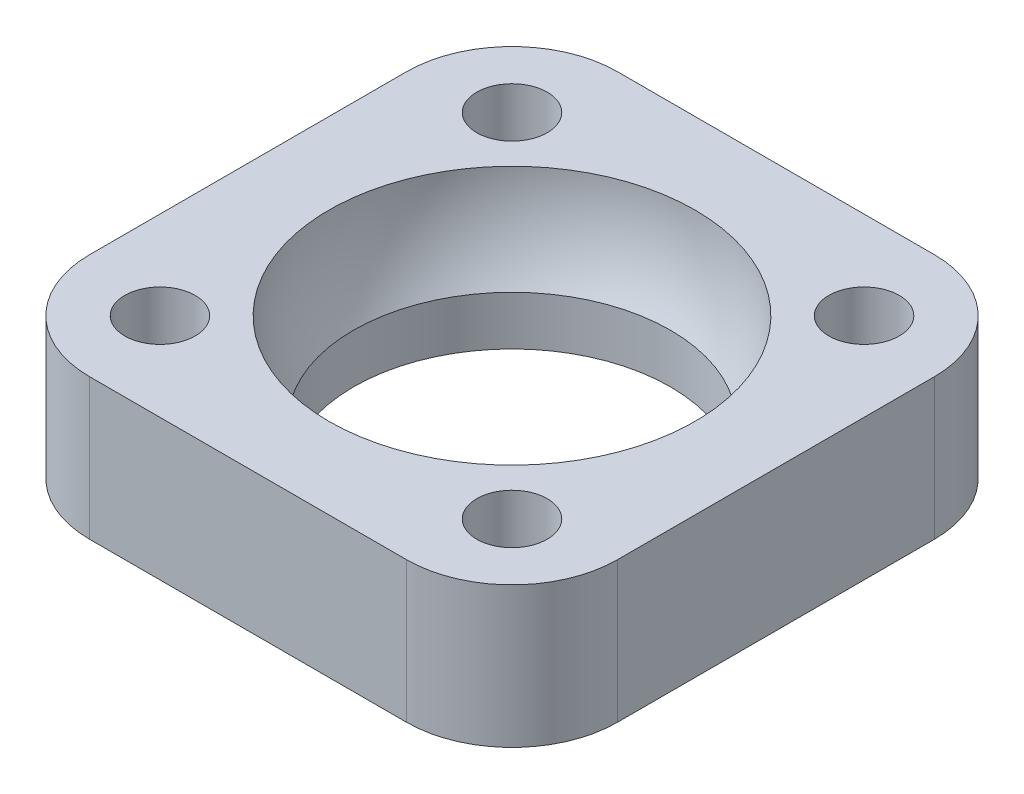
ISO-10303-21;
HEADER;
FILE_DESCRIPTION(('STEP AP214'),'2;1');
FILE_NAME('part.step','',(''),(''),'','','');
FILE_SCHEMA(('AUTOMOTIVE_DESIGN { 1 0 10303 214 1 1 1 1 }'));
ENDSEC;
DATA;
#1=APPLICATION_CONTEXT('core data for automotive mechanical design processes');
#2=APPLICATION_PROTOCOL_DEFINITION('international standard','automotive_design',2000,#1);
#3=PRODUCT_CONTEXT('',#1,'mechanical');
#4=PRODUCT('Part','Part','',(#3));
#5=PRODUCT_RELATED_PRODUCT_CATEGORY('part','',(#4));
#6=PRODUCT_DEFINITION_FORMATION('','',#4);
#7=PRODUCT_DEFINITION_CONTEXT('part definition',#1,'design');
#8=PRODUCT_DEFINITION('design','',#6,#7);
#9=PRODUCT_DEFINITION_SHAPE('','',#8);
#10=(LENGTH_UNIT() NAMED_UNIT(*) SI_UNIT(.MILLI.,.METRE.));
#11=(NAMED_UNIT(*) PLANE_ANGLE_UNIT() SI_UNIT($,.RADIAN.));
#12=(NAMED_UNIT(*) SI_UNIT($,.STERADIAN.) SOLID_ANGLE_UNIT());
#13=UNCERTAINTY_MEASURE_WITH_UNIT(LENGTH_MEASURE(1.E-05),#10,'distance_accuracy_value','');
#14=(GEOMETRIC_REPRESENTATION_CONTEXT(3) GLOBAL_UNCERTAINTY_ASSIGNED_CONTEXT((#13)) GLOBAL_UNIT_ASSIGNED_CONTEXT((#10,
#11,#12)) REPRESENTATION_CONTEXT('',''));
#15=CARTESIAN_POINT('',(0.,0.,0.));
#16=DIRECTION('',(0.,0.,1.));
#17=DIRECTION('',(1.,0.,0.));
#18=AXIS2_PLACEMENT_3D('',#15,#16,#17);
#19=CARTESIAN_POINT('',(0.,4.,0.));
#20=DIRECTION('',(1.,0.,0.));
#21=DIRECTION('',(0.,0.,-1.));
#22=AXIS2_PLACEMENT_3D('',#19,#20,#21);
#23=PLANE('',#22);
#24=DIRECTION('',(0.,0.,1.));
#25=VECTOR('',#24,1.);
#26=CARTESIAN_POINT('',(0.,0.,0.));
#27=LINE('',#26,#25);
#28=CARTESIAN_POINT('',(0.,0.,3.));
#29=VERTEX_POINT('',#28);
#30=CARTESIAN_POINT('',(0.,0.,12.));
#31=VERTEX_POINT('',#30);
#32=EDGE_CURVE('E130',#29,#31,#27,.T.);
#33=ORIENTED_EDGE('',*,*,#32,.T.);
#34=DIRECTION('',(0.,-1.,0.));
#35=VECTOR('',#34,1.);
#36=CARTESIAN_POINT('',(0.,4.,12.));
#37=LINE('',#36,#35);
#38=CARTESIAN_POINT('',(0.,4.,12.));
#39=VERTEX_POINT('',#38);
#40=EDGE_CURVE('E157',#31,#39,#37,.F.);
#41=ORIENTED_EDGE('',*,*,#40,.T.);
#42=DIRECTION('',(0.,0.,1.));
#43=VECTOR('',#42,1.);
#44=CARTESIAN_POINT('',(0.,4.,0.));
#45=LINE('',#44,#43);
#46=CARTESIAN_POINT('',(0.,4.,3.));
#47=VERTEX_POINT('',#46);
#48=EDGE_CURVE('E128',#47,#39,#45,.T.);
#49=ORIENTED_EDGE('',*,*,#48,.F.);
#50=DIRECTION('',(0.,-1.,0.));
#51=VECTOR('',#50,1.);
#52=CARTESIAN_POINT('',(0.,4.,3.));
#53=LINE('',#52,#51);
#54=EDGE_CURVE('E154',#47,#29,#53,.T.);
#55=ORIENTED_EDGE('',*,*,#54,.T.);
#56=EDGE_LOOP('',(#33,#41,#49,#55));
#57=FACE_BOUND('',#56,.T.);
#58=ADVANCED_FACE('F33',(#57),#23,.F.);
#59=CARTESIAN_POINT('',(0.,4.,15.));
#60=DIRECTION('',(0.,0.,-1.));
#61=DIRECTION('',(-1.,0.,0.));
#62=AXIS2_PLACEMENT_3D('',#59,#60,#61);
#63=PLANE('',#62);
#64=DIRECTION('',(1.,0.,0.));
#65=VECTOR('',#64,1.);
#66=CARTESIAN_POINT('',(0.,0.,15.));
#67=LINE('',#66,#65);
#68=CARTESIAN_POINT('',(3.,0.,15.));
#69=VERTEX_POINT('',#68);
#70=CARTESIAN_POINT('',(12.,0.,15.));
#71=VERTEX_POINT('',#70);
#72=EDGE_CURVE('E126',#69,#71,#67,.T.);
#73=ORIENTED_EDGE('',*,*,#72,.T.);
#74=DIRECTION('',(0.,-1.,0.));
#75=VECTOR('',#74,1.);
#76=CARTESIAN_POINT('',(12.,4.,15.));
#77=LINE('',#76,#75);
#78=CARTESIAN_POINT('',(12.,4.,15.));
#79=VERTEX_POINT('',#78);
#80=EDGE_CURVE('E104',#71,#79,#77,.F.);
#81=ORIENTED_EDGE('',*,*,#80,.T.);
#82=DIRECTION('',(1.,0.,0.));
#83=VECTOR('',#82,1.);
#84=CARTESIAN_POINT('',(0.,4.,15.));
#85=LINE('',#84,#83);
#86=CARTESIAN_POINT('',(3.,4.,15.));
#87=VERTEX_POINT('',#86);
#88=EDGE_CURVE('E171',#87,#79,#85,.T.);
#89=ORIENTED_EDGE('',*,*,#88,.F.);
#90=DIRECTION('',(0.,-1.,0.));
#91=VECTOR('',#90,1.);
#92=CARTESIAN_POINT('',(3.,4.,15.));
#93=LINE('',#92,#91);
#94=EDGE_CURVE('E109',#87,#69,#93,.T.);
#95=ORIENTED_EDGE('',*,*,#94,.T.);
#96=EDGE_LOOP('',(#73,#81,#89,#95));
#97=FACE_BOUND('',#96,.T.);
#98=ADVANCED_FACE('F176',(#97),#63,.F.);
#99=CARTESIAN_POINT('',(15.,4.,0.));
#100=DIRECTION('',(-1.,0.,0.));
#101=DIRECTION('',(0.,0.,1.));
#102=AXIS2_PLACEMENT_3D('',#99,#100,#101);
#103=PLANE('',#102);
#104=DIRECTION('',(0.,0.,-1.));
#105=VECTOR('',#104,1.);
#106=CARTESIAN_POINT('',(15.,4.,0.));
#107=LINE('',#106,#105);
#108=CARTESIAN_POINT('',(15.,4.,12.));
#109=VERTEX_POINT('',#108);
#110=CARTESIAN_POINT('',(15.,4.,3.));
#111=VERTEX_POINT('',#110);
#112=EDGE_CURVE('E118',#109,#111,#107,.T.);
#113=ORIENTED_EDGE('',*,*,#112,.F.);
#114=DIRECTION('',(0.,-1.,0.));
#115=VECTOR('',#114,1.);
#116=CARTESIAN_POINT('',(15.,4.,12.));
#117=LINE('',#116,#115);
#118=CARTESIAN_POINT('',(15.,0.,12.));
#119=VERTEX_POINT('',#118);
#120=EDGE_CURVE('E103',#109,#119,#117,.T.);
#121=ORIENTED_EDGE('',*,*,#120,.T.);
#122=DIRECTION('',(0.,0.,-1.));
#123=VECTOR('',#122,1.);
#124=CARTESIAN_POINT('',(15.,0.,0.));
#125=LINE('',#124,#123);
#126=CARTESIAN_POINT('',(15.,0.,3.));
#127=VERTEX_POINT('',#126);
#128=EDGE_CURVE('E116',#119,#127,#125,.T.);
#129=ORIENTED_EDGE('',*,*,#128,.T.);
#130=DIRECTION('',(0.,-1.,0.));
#131=VECTOR('',#130,1.);
#132=CARTESIAN_POINT('',(15.,4.,3.));
#133=LINE('',#132,#131);
#134=EDGE_CURVE('E120',#127,#111,#133,.F.);
#135=ORIENTED_EDGE('',*,*,#134,.T.);
#136=EDGE_LOOP('',(#113,#121,#129,#135));
#137=FACE_BOUND('',#136,.T.);
#138=ADVANCED_FACE('F115',(#137),#103,.F.);
#139=CARTESIAN_POINT('',(0.,4.,0.));
#140=DIRECTION('',(0.,0.,1.));
#141=DIRECTION('',(1.,0.,0.));
#142=AXIS2_PLACEMENT_3D('',#139,#140,#141);
#143=PLANE('',#142);
#144=DIRECTION('',(-1.,0.,0.));
#145=VECTOR('',#144,1.);
#146=CARTESIAN_POINT('',(0.,4.,0.));
#147=LINE('',#146,#145);
#148=CARTESIAN_POINT('',(12.,4.,0.));
#149=VERTEX_POINT('',#148);
#150=CARTESIAN_POINT('',(3.,4.,0.));
#151=VERTEX_POINT('',#150);
#152=EDGE_CURVE('E139',#149,#151,#147,.T.);
#153=ORIENTED_EDGE('',*,*,#152,.F.);
#154=DIRECTION('',(0.,-1.,0.));
#155=VECTOR('',#154,1.);
#156=CARTESIAN_POINT('',(12.,4.,0.));
#157=LINE('',#156,#155);
#158=CARTESIAN_POINT('',(12.,0.,0.));
#159=VERTEX_POINT('',#158);
#160=EDGE_CURVE('E11',#149,#159,#157,.T.);
#161=ORIENTED_EDGE('',*,*,#160,.T.);
#162=DIRECTION('',(-1.,0.,0.));
#163=VECTOR('',#162,1.);
#164=CARTESIAN_POINT('',(0.,0.,0.));
#165=LINE('',#164,#163);
#166=CARTESIAN_POINT('',(3.,0.,0.));
#167=VERTEX_POINT('',#166);
#168=EDGE_CURVE('E125',#159,#167,#165,.T.);
#169=ORIENTED_EDGE('',*,*,#168,.T.);
#170=DIRECTION('',(0.,-1.,0.));
#171=VECTOR('',#170,1.);
#172=CARTESIAN_POINT('',(3.,4.,0.));
#173=LINE('',#172,#171);
#174=EDGE_CURVE('E41',#167,#151,#173,.F.);
#175=ORIENTED_EDGE('',*,*,#174,.T.);
#176=EDGE_LOOP('',(#153,#161,#169,#175));
#177=FACE_BOUND('',#176,.T.);
#178=ADVANCED_FACE('F233',(#177),#143,.F.);
#179=CARTESIAN_POINT('',(0.,4.,0.));
#180=DIRECTION('',(0.,1.,0.));
#181=DIRECTION('',(0.,0.,1.));
#182=AXIS2_PLACEMENT_3D('',#179,#180,#181);
#183=PLANE('',#182);
#184=CARTESIAN_POINT('',(12.5,4.,12.5));
#185=DIRECTION('',(0.,1.,0.));
#186=DIRECTION('',(0.,0.,1.));
#187=AXIS2_PLACEMENT_3D('',#184,#185,#186);
#188=CIRCLE('',#187,1.);
#189=CARTESIAN_POINT('',(12.5,4.,13.5));
#190=VERTEX_POINT('',#189);
#191=EDGE_CURVE('E202',#190,#190,#188,.T.);
#192=ORIENTED_EDGE('',*,*,#191,.F.);
#193=EDGE_LOOP('',(#192));
#194=FACE_BOUND('',#193,.T.);
#195=CARTESIAN_POINT('',(12.5,4.,2.5));
#196=DIRECTION('',(0.,1.,0.));
#197=DIRECTION('',(0.,0.,1.));
#198=AXIS2_PLACEMENT_3D('',#195,#196,#197);
#199=CIRCLE('',#198,1.);
#200=CARTESIAN_POINT('',(12.5,4.,3.5));
#201=VERTEX_POINT('',#200);
#202=EDGE_CURVE('E196',#201,#201,#199,.T.);
#203=ORIENTED_EDGE('',*,*,#202,.F.);
#204=EDGE_LOOP('',(#203));
#205=FACE_BOUND('',#204,.T.);
#206=CARTESIAN_POINT('',(2.49999999999996,4.,2.5));
#207=DIRECTION('',(0.,1.,0.));
#208=DIRECTION('',(0.,0.,1.));
#209=AXIS2_PLACEMENT_3D('',#206,#207,#208);
#210=CIRCLE('',#209,1.);
#211=CARTESIAN_POINT('',(2.49999999999996,4.,3.5));
#212=VERTEX_POINT('',#211);
#213=EDGE_CURVE('E137',#212,#212,#210,.T.);
#214=ORIENTED_EDGE('',*,*,#213,.F.);
#215=EDGE_LOOP('',(#214));
#216=FACE_BOUND('',#215,.T.);
#217=CARTESIAN_POINT('',(2.5,4.,12.5));
#218=DIRECTION('',(0.,1.,0.));
#219=DIRECTION('',(0.,0.,1.));
#220=AXIS2_PLACEMENT_3D('',#217,#218,#219);
#221=CIRCLE('',#220,1.);
#222=CARTESIAN_POINT('',(2.5,4.,13.5));
#223=VERTEX_POINT('',#222);
#224=EDGE_CURVE('E185',#223,#223,#221,.T.);
#225=ORIENTED_EDGE('',*,*,#224,.F.);
#226=EDGE_LOOP('',(#225));
#227=FACE_BOUND('',#226,.T.);
#228=CARTESIAN_POINT('',(7.50000000000001,4.,7.5));
#229=DIRECTION('',(0.,1.,0.));
#230=DIRECTION('',(0.,0.,1.));
#231=AXIS2_PLACEMENT_3D('',#228,#229,#230);
#232=CIRCLE('',#231,5.2);
#233=CARTESIAN_POINT('',(7.50000000000001,4.,12.7));
#234=VERTEX_POINT('',#233);
#235=EDGE_CURVE('E177',#234,#234,#232,.F.);
#236=ORIENTED_EDGE('',*,*,#235,.T.);
#237=EDGE_LOOP('',(#236));
#238=FACE_BOUND('',#237,.T.);
#239=ORIENTED_EDGE('',*,*,#88,.T.);
#240=CARTESIAN_POINT('',(12.,4.,12.));
#241=DIRECTION('',(0.,1.,0.));
#242=DIRECTION('',(0.,0.,1.));
#243=AXIS2_PLACEMENT_3D('',#240,#241,#242);
#244=CIRCLE('',#243,3.);
#245=EDGE_CURVE('E152',#79,#109,#244,.T.);
#246=ORIENTED_EDGE('',*,*,#245,.T.);
#247=ORIENTED_EDGE('',*,*,#112,.T.);
#248=CARTESIAN_POINT('',(12.,4.,3.));
#249=DIRECTION('',(0.,1.,0.));
#250=DIRECTION('',(0.,0.,1.));
#251=AXIS2_PLACEMENT_3D('',#248,#249,#250);
#252=CIRCLE('',#251,3.);
#253=EDGE_CURVE('E54',#111,#149,#252,.T.);
#254=ORIENTED_EDGE('',*,*,#253,.T.);
#255=ORIENTED_EDGE('',*,*,#152,.T.);
#256=CARTESIAN_POINT('',(3.,4.,3.));
#257=DIRECTION('',(0.,1.,0.));
#258=DIRECTION('',(0.,0.,1.));
#259=AXIS2_PLACEMENT_3D('',#256,#257,#258);
#260=CIRCLE('',#259,3.);
#261=EDGE_CURVE('E147',#151,#47,#260,.T.);
#262=ORIENTED_EDGE('',*,*,#261,.T.);
#263=ORIENTED_EDGE('',*,*,#48,.T.);
#264=CARTESIAN_POINT('',(3.,4.,12.));
#265=DIRECTION('',(0.,1.,0.));
#266=DIRECTION('',(0.,0.,1.));
#267=AXIS2_PLACEMENT_3D('',#264,#265,#266);
#268=CIRCLE('',#267,3.);
#269=EDGE_CURVE('E150',#39,#87,#268,.T.);
#270=ORIENTED_EDGE('',*,*,#269,.T.);
#271=EDGE_LOOP('',(#239,#246,#247,#254,#255,#262,#263,#270));
#272=FACE_BOUND('',#271,.T.);
#273=ADVANCED_FACE('F168',(#194,#205,#216,#227,#238,#272),#183,.T.);
#274=CARTESIAN_POINT('',(0.,0.,0.));
#275=DIRECTION('',(0.,1.,0.));
#276=DIRECTION('',(0.,0.,1.));
#277=AXIS2_PLACEMENT_3D('',#274,#275,#276);
#278=PLANE('',#277);
#279=CARTESIAN_POINT('',(7.50000000000001,0.,7.5));
#280=DIRECTION('',(0.,-1.,0.));
#281=DIRECTION('',(0.,0.,-1.));
#282=AXIS2_PLACEMENT_3D('',#279,#280,#281);
#283=CIRCLE('',#282,4.5);
#284=CARTESIAN_POINT('',(7.50000000000001,0.,3.));
#285=VERTEX_POINT('',#284);
#286=EDGE_CURVE('E138',#285,#285,#283,.T.);
#287=ORIENTED_EDGE('',*,*,#286,.F.);
#288=EDGE_LOOP('',(#287));
#289=FACE_BOUND('',#288,.T.);
#290=CARTESIAN_POINT('',(12.5,0.,12.5));
#291=DIRECTION('',(0.,1.,0.));
#292=DIRECTION('',(0.,0.,1.));
#293=AXIS2_PLACEMENT_3D('',#290,#291,#292);
#294=CIRCLE('',#293,1.);
#295=CARTESIAN_POINT('',(12.5,0.,13.5));
#296=VERTEX_POINT('',#295);
#297=EDGE_CURVE('E188',#296,#296,#294,.T.);
#298=ORIENTED_EDGE('',*,*,#297,.T.);
#299=EDGE_LOOP('',(#298));
#300=FACE_BOUND('',#299,.T.);
#301=CARTESIAN_POINT('',(12.5,0.,2.5));
#302=DIRECTION('',(0.,1.,0.));
#303=DIRECTION('',(0.,0.,1.));
#304=AXIS2_PLACEMENT_3D('',#301,#302,#303);
#305=CIRCLE('',#304,1.);
#306=CARTESIAN_POINT('',(12.5,0.,3.5));
#307=VERTEX_POINT('',#306);
#308=EDGE_CURVE('E199',#307,#307,#305,.T.);
#309=ORIENTED_EDGE('',*,*,#308,.T.);
#310=EDGE_LOOP('',(#309));
#311=FACE_BOUND('',#310,.T.);
#312=CARTESIAN_POINT('',(2.49999999999996,0.,2.5));
#313=DIRECTION('',(0.,1.,0.));
#314=DIRECTION('',(0.,0.,1.));
#315=AXIS2_PLACEMENT_3D('',#312,#313,#314);
#316=CIRCLE('',#315,1.);
#317=CARTESIAN_POINT('',(2.49999999999996,0.,3.5));
#318=VERTEX_POINT('',#317);
#319=EDGE_CURVE('E193',#318,#318,#316,.T.);
#320=ORIENTED_EDGE('',*,*,#319,.T.);
#321=EDGE_LOOP('',(#320));
#322=FACE_BOUND('',#321,.T.);
#323=CARTESIAN_POINT('',(2.5,0.,12.5));
#324=DIRECTION('',(0.,1.,0.));
#325=DIRECTION('',(0.,0.,1.));
#326=AXIS2_PLACEMENT_3D('',#323,#324,#325);
#327=CIRCLE('',#326,1.);
#328=CARTESIAN_POINT('',(2.5,0.,13.5));
#329=VERTEX_POINT('',#328);
#330=EDGE_CURVE('E179',#329,#329,#327,.T.);
#331=ORIENTED_EDGE('',*,*,#330,.T.);
#332=EDGE_LOOP('',(#331));
#333=FACE_BOUND('',#332,.T.);
#334=ORIENTED_EDGE('',*,*,#128,.F.);
#335=CARTESIAN_POINT('',(12.,0.,12.));
#336=DIRECTION('',(0.,1.,0.));
#337=DIRECTION('',(0.,0.,1.));
#338=AXIS2_PLACEMENT_3D('',#335,#336,#337);
#339=CIRCLE('',#338,3.);
#340=EDGE_CURVE('E99',#119,#71,#339,.F.);
#341=ORIENTED_EDGE('',*,*,#340,.T.);
#342=ORIENTED_EDGE('',*,*,#72,.F.);
#343=CARTESIAN_POINT('',(3.,0.,12.));
#344=DIRECTION('',(0.,1.,0.));
#345=DIRECTION('',(0.,0.,1.));
#346=AXIS2_PLACEMENT_3D('',#343,#344,#345);
#347=CIRCLE('',#346,3.);
#348=EDGE_CURVE('E110',#69,#31,#347,.F.);
#349=ORIENTED_EDGE('',*,*,#348,.T.);
#350=ORIENTED_EDGE('',*,*,#32,.F.);
#351=CARTESIAN_POINT('',(3.,0.,3.));
#352=DIRECTION('',(0.,1.,0.));
#353=DIRECTION('',(0.,0.,1.));
#354=AXIS2_PLACEMENT_3D('',#351,#352,#353);
#355=CIRCLE('',#354,3.);
#356=EDGE_CURVE('E119',#29,#167,#355,.F.);
#357=ORIENTED_EDGE('',*,*,#356,.T.);
#358=ORIENTED_EDGE('',*,*,#168,.F.);
#359=CARTESIAN_POINT('',(12.,0.,3.));
#360=DIRECTION('',(0.,1.,0.));
#361=DIRECTION('',(0.,0.,1.));
#362=AXIS2_PLACEMENT_3D('',#359,#360,#361);
#363=CIRCLE('',#362,3.);
#364=EDGE_CURVE('E124',#159,#127,#363,.F.);
#365=ORIENTED_EDGE('',*,*,#364,.T.);
#366=EDGE_LOOP('',(#334,#341,#342,#349,#350,#357,#358,#365));
#367=FACE_BOUND('',#366,.T.);
#368=ADVANCED_FACE('F122',(#289,#300,#311,#322,#333,#367),#278,.F.);
#369=CARTESIAN_POINT('',(7.50000000000001,4.,7.5));
#370=DIRECTION('',(1.,0.,0.));
#371=DIRECTION('',(0.,0.,1.));
#372=AXIS2_PLACEMENT_3D('',#369,#370,#371);
#373=SPHERICAL_SURFACE('',#372,5.2);
#374=CARTESIAN_POINT('',(7.50000000000001,4.,7.5));
#375=DIRECTION('',(0.,1.,0.));
#376=DIRECTION('',(0.,0.,1.));
#377=AXIS2_PLACEMENT_3D('',#374,#375,#376);
#378=SPHERICAL_SURFACE('',#377,5.2);
#379=CARTESIAN_POINT('',(7.50000000000001,1.39423715584092,7.5));
#380=DIRECTION('',(0.,1.,0.));
#381=DIRECTION('',(0.,0.,1.));
#382=AXIS2_PLACEMENT_3D('',#379,#380,#381);
#383=CIRCLE('',#382,4.5);
#384=CARTESIAN_POINT('',(7.50000000000001,1.39423715584092,12.));
#385=VERTEX_POINT('',#384);
#386=EDGE_CURVE('E134',#385,#385,#383,.T.);
#387=ORIENTED_EDGE('',*,*,#386,.F.);
#388=EDGE_LOOP('',(#387));
#389=FACE_BOUND('',#388,.T.);
#390=ORIENTED_EDGE('',*,*,#235,.F.);
#391=EDGE_LOOP('',(#390));
#392=FACE_BOUND('',#391,.T.);
#393=ADVANCED_FACE('F214',(#389,#392),#378,.F.);
#394=CARTESIAN_POINT('',(2.5,0.,12.5));
#395=DIRECTION('',(0.,1.,0.));
#396=DIRECTION('',(0.,0.,1.));
#397=AXIS2_PLACEMENT_3D('',#394,#395,#396);
#398=CYLINDRICAL_SURFACE('',#397,1.);
#399=ORIENTED_EDGE('',*,*,#330,.F.);
#400=EDGE_LOOP('',(#399));
#401=FACE_BOUND('',#400,.T.);
#402=ORIENTED_EDGE('',*,*,#224,.T.);
#403=EDGE_LOOP('',(#402));
#404=FACE_BOUND('',#403,.T.);
#405=ADVANCED_FACE('F224',(#401,#404),#398,.F.);
#406=CARTESIAN_POINT('',(2.49999999999996,0.,2.5));
#407=DIRECTION('',(0.,1.,0.));
#408=DIRECTION('',(0.,0.,1.));
#409=AXIS2_PLACEMENT_3D('',#406,#407,#408);
#410=CYLINDRICAL_SURFACE('',#409,1.);
#411=ORIENTED_EDGE('',*,*,#319,.F.);
#412=EDGE_LOOP('',(#411));
#413=FACE_BOUND('',#412,.T.);
#414=ORIENTED_EDGE('',*,*,#213,.T.);
#415=EDGE_LOOP('',(#414));
#416=FACE_BOUND('',#415,.T.);
#417=ADVANCED_FACE('F227',(#413,#416),#410,.F.);
#418=CARTESIAN_POINT('',(12.5,0.,2.5));
#419=DIRECTION('',(0.,1.,0.));
#420=DIRECTION('',(0.,0.,1.));
#421=AXIS2_PLACEMENT_3D('',#418,#419,#420);
#422=CYLINDRICAL_SURFACE('',#421,1.);
#423=ORIENTED_EDGE('',*,*,#308,.F.);
#424=EDGE_LOOP('',(#423));
#425=FACE_BOUND('',#424,.T.);
#426=ORIENTED_EDGE('',*,*,#202,.T.);
#427=EDGE_LOOP('',(#426));
#428=FACE_BOUND('',#427,.T.);
#429=ADVANCED_FACE('F315',(#425,#428),#422,.F.);
#430=CARTESIAN_POINT('',(12.5,0.,12.5));
#431=DIRECTION('',(0.,1.,0.));
#432=DIRECTION('',(0.,0.,1.));
#433=AXIS2_PLACEMENT_3D('',#430,#431,#432);
#434=CYLINDRICAL_SURFACE('',#433,1.);
#435=ORIENTED_EDGE('',*,*,#297,.F.);
#436=EDGE_LOOP('',(#435));
#437=FACE_BOUND('',#436,.T.);
#438=ORIENTED_EDGE('',*,*,#191,.T.);
#439=EDGE_LOOP('',(#438));
#440=FACE_BOUND('',#439,.T.);
#441=ADVANCED_FACE('F324',(#437,#440),#434,.F.);
#442=CARTESIAN_POINT('',(7.50000000000001,4.,7.5));
#443=DIRECTION('',(0.,-1.,0.));
#444=DIRECTION('',(0.,0.,-1.));
#445=AXIS2_PLACEMENT_3D('',#442,#443,#444);
#446=CYLINDRICAL_SURFACE('',#445,4.5);
#447=ORIENTED_EDGE('',*,*,#386,.T.);
#448=EDGE_LOOP('',(#447));
#449=FACE_BOUND('',#448,.T.);
#450=ORIENTED_EDGE('',*,*,#286,.T.);
#451=EDGE_LOOP('',(#450));
#452=FACE_BOUND('',#451,.T.);
#453=ADVANCED_FACE('F210',(#449,#452),#446,.F.);
#454=CARTESIAN_POINT('',(12.,4.,12.));
#455=DIRECTION('',(0.,-1.,0.));
#456=DIRECTION('',(0.,0.,-1.));
#457=AXIS2_PLACEMENT_3D('',#454,#455,#456);
#458=CYLINDRICAL_SURFACE('',#457,3.);
#459=ORIENTED_EDGE('',*,*,#245,.F.);
#460=ORIENTED_EDGE('',*,*,#80,.F.);
#461=ORIENTED_EDGE('',*,*,#340,.F.);
#462=ORIENTED_EDGE('',*,*,#120,.F.);
#463=EDGE_LOOP('',(#459,#460,#461,#462));
#464=FACE_BOUND('',#463,.T.);
#465=ADVANCED_FACE('F102',(#464),#458,.T.);
#466=CARTESIAN_POINT('',(3.,4.,12.));
#467=DIRECTION('',(0.,-1.,0.));
#468=DIRECTION('',(0.,0.,-1.));
#469=AXIS2_PLACEMENT_3D('',#466,#467,#468);
#470=CYLINDRICAL_SURFACE('',#469,3.);
#471=ORIENTED_EDGE('',*,*,#269,.F.);
#472=ORIENTED_EDGE('',*,*,#40,.F.);
#473=ORIENTED_EDGE('',*,*,#348,.F.);
#474=ORIENTED_EDGE('',*,*,#94,.F.);
#475=EDGE_LOOP('',(#471,#472,#473,#474));
#476=FACE_BOUND('',#475,.T.);
#477=ADVANCED_FACE('F174',(#476),#470,.T.);
#478=CARTESIAN_POINT('',(12.,4.,3.));
#479=DIRECTION('',(0.,-1.,0.));
#480=DIRECTION('',(0.,0.,-1.));
#481=AXIS2_PLACEMENT_3D('',#478,#479,#480);
#482=CYLINDRICAL_SURFACE('',#481,3.);
#483=ORIENTED_EDGE('',*,*,#253,.F.);
#484=ORIENTED_EDGE('',*,*,#134,.F.);
#485=ORIENTED_EDGE('',*,*,#364,.F.);
#486=ORIENTED_EDGE('',*,*,#160,.F.);
#487=EDGE_LOOP('',(#483,#484,#485,#486));
#488=FACE_BOUND('',#487,.T.);
#489=ADVANCED_FACE('F257',(#488),#482,.T.);
#490=CARTESIAN_POINT('',(3.,4.,3.));
#491=DIRECTION('',(0.,-1.,0.));
#492=DIRECTION('',(0.,0.,-1.));
#493=AXIS2_PLACEMENT_3D('',#490,#491,#492);
#494=CYLINDRICAL_SURFACE('',#493,3.);
#495=ORIENTED_EDGE('',*,*,#261,.F.);
#496=ORIENTED_EDGE('',*,*,#174,.F.);
#497=ORIENTED_EDGE('',*,*,#356,.F.);
#498=ORIENTED_EDGE('',*,*,#54,.F.);
#499=EDGE_LOOP('',(#495,#496,#497,#498));
#500=FACE_BOUND('',#499,.T.);
#501=ADVANCED_FACE('F35',(#500),#494,.T.);
#502=CLOSED_SHELL('',(#58,#98,#138,#178,#273,#368,#393,#405,#417,#429,#441,#453,#465,#477,#489,#501));
#503=MANIFOLD_SOLID_BREP('B2',#502);
#504=ADVANCED_BREP_SHAPE_REPRESENTATION('',(#18,#503),#14);
#505=SHAPE_DEFINITION_REPRESENTATION(#9,#504);
ENDSEC;
END-ISO-10303-21;
